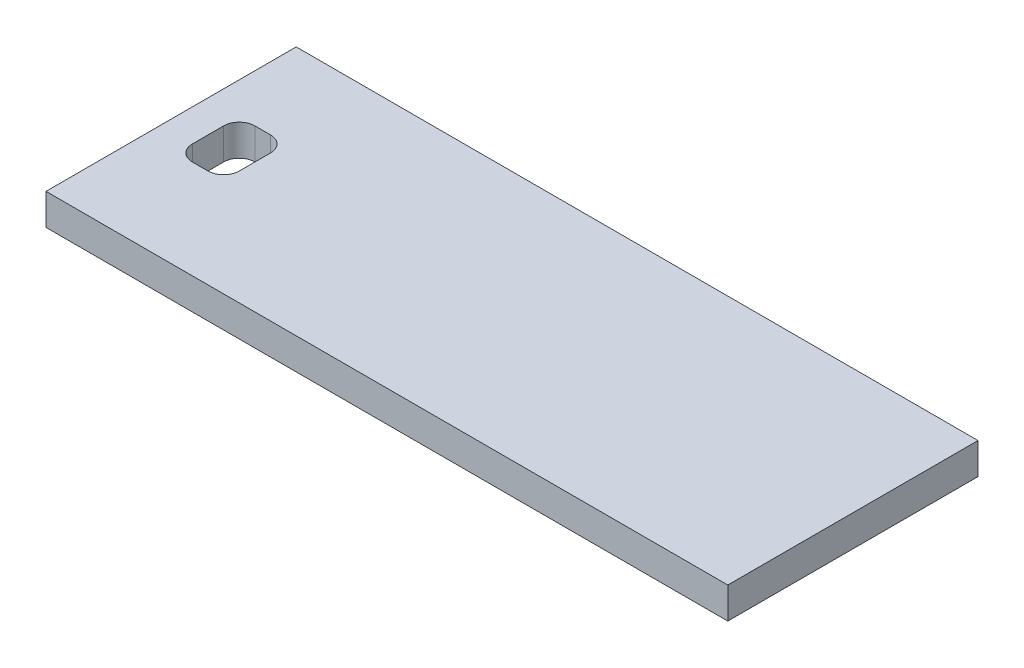
ISO-10303-21;
HEADER;
FILE_DESCRIPTION(('STEP AP214'),'2;1');
FILE_NAME('part.step','',(''),(''),'','','');
FILE_SCHEMA(('AUTOMOTIVE_DESIGN { 1 0 10303 214 1 1 1 1 }'));
ENDSEC;
DATA;
#1=APPLICATION_CONTEXT('core data for automotive mechanical design processes');
#2=APPLICATION_PROTOCOL_DEFINITION('international standard','automotive_design',2000,#1);
#3=PRODUCT_CONTEXT('',#1,'mechanical');
#4=PRODUCT('Part','Part','',(#3));
#5=PRODUCT_RELATED_PRODUCT_CATEGORY('part','',(#4));
#6=PRODUCT_DEFINITION_FORMATION('','',#4);
#7=PRODUCT_DEFINITION_CONTEXT('part definition',#1,'design');
#8=PRODUCT_DEFINITION('design','',#6,#7);
#9=PRODUCT_DEFINITION_SHAPE('','',#8);
#10=(LENGTH_UNIT() NAMED_UNIT(*) SI_UNIT(.MILLI.,.METRE.));
#11=(NAMED_UNIT(*) PLANE_ANGLE_UNIT() SI_UNIT($,.RADIAN.));
#12=(NAMED_UNIT(*) SI_UNIT($,.STERADIAN.) SOLID_ANGLE_UNIT());
#13=UNCERTAINTY_MEASURE_WITH_UNIT(LENGTH_MEASURE(1.E-05),#10,'distance_accuracy_value','');
#14=(GEOMETRIC_REPRESENTATION_CONTEXT(3) GLOBAL_UNCERTAINTY_ASSIGNED_CONTEXT((#13)) GLOBAL_UNIT_ASSIGNED_CONTEXT((#10,
#11,#12)) REPRESENTATION_CONTEXT('',''));
#15=CARTESIAN_POINT('',(0.,0.,0.));
#16=DIRECTION('',(0.,0.,1.));
#17=DIRECTION('',(1.,0.,0.));
#18=AXIS2_PLACEMENT_3D('',#15,#16,#17);
#19=CARTESIAN_POINT('',(109.,10.,-40.));
#20=DIRECTION('',(-1.,0.,0.));
#21=DIRECTION('',(0.,0.,1.));
#22=AXIS2_PLACEMENT_3D('',#19,#20,#21);
#23=PLANE('',#22);
#24=DIRECTION('',(0.,0.,-1.));
#25=VECTOR('',#24,1.);
#26=CARTESIAN_POINT('',(109.,0.,-40.));
#27=LINE('',#26,#25);
#28=CARTESIAN_POINT('',(109.,0.,40.));
#29=VERTEX_POINT('',#28);
#30=CARTESIAN_POINT('',(109.,0.,-40.));
#31=VERTEX_POINT('',#30);
#32=EDGE_CURVE('E148',#29,#31,#27,.T.);
#33=ORIENTED_EDGE('',*,*,#32,.T.);
#34=DIRECTION('',(0.,-1.,0.));
#35=VECTOR('',#34,1.);
#36=CARTESIAN_POINT('',(109.,10.,-40.));
#37=LINE('',#36,#35);
#38=CARTESIAN_POINT('',(109.,10.,-40.));
#39=VERTEX_POINT('',#38);
#40=EDGE_CURVE('E129',#39,#31,#37,.T.);
#41=ORIENTED_EDGE('',*,*,#40,.F.);
#42=DIRECTION('',(0.,0.,-1.));
#43=VECTOR('',#42,1.);
#44=CARTESIAN_POINT('',(109.,10.,-40.));
#45=LINE('',#44,#43);
#46=CARTESIAN_POINT('',(109.,10.,40.));
#47=VERTEX_POINT('',#46);
#48=EDGE_CURVE('E136',#47,#39,#45,.T.);
#49=ORIENTED_EDGE('',*,*,#48,.F.);
#50=DIRECTION('',(0.,-1.,0.));
#51=VECTOR('',#50,1.);
#52=CARTESIAN_POINT('',(109.,10.,40.));
#53=LINE('',#52,#51);
#54=EDGE_CURVE('E222',#47,#29,#53,.T.);
#55=ORIENTED_EDGE('',*,*,#54,.T.);
#56=EDGE_LOOP('',(#33,#41,#49,#55));
#57=FACE_BOUND('',#56,.T.);
#58=ADVANCED_FACE('F35',(#57),#23,.F.);
#59=CARTESIAN_POINT('',(-109.,10.,-40.));
#60=DIRECTION('',(0.,0.,1.));
#61=DIRECTION('',(1.,0.,0.));
#62=AXIS2_PLACEMENT_3D('',#59,#60,#61);
#63=PLANE('',#62);
#64=DIRECTION('',(-1.,0.,0.));
#65=VECTOR('',#64,1.);
#66=CARTESIAN_POINT('',(-109.,0.,-40.));
#67=LINE('',#66,#65);
#68=CARTESIAN_POINT('',(-109.,0.,-40.));
#69=VERTEX_POINT('',#68);
#70=EDGE_CURVE('E224',#31,#69,#67,.T.);
#71=ORIENTED_EDGE('',*,*,#70,.T.);
#72=DIRECTION('',(0.,-1.,0.));
#73=VECTOR('',#72,1.);
#74=CARTESIAN_POINT('',(-109.,10.,-40.));
#75=LINE('',#74,#73);
#76=CARTESIAN_POINT('',(-109.,10.,-40.));
#77=VERTEX_POINT('',#76);
#78=EDGE_CURVE('E132',#77,#69,#75,.T.);
#79=ORIENTED_EDGE('',*,*,#78,.F.);
#80=DIRECTION('',(-1.,0.,0.));
#81=VECTOR('',#80,1.);
#82=CARTESIAN_POINT('',(-109.,10.,-40.));
#83=LINE('',#82,#81);
#84=EDGE_CURVE('E125',#39,#77,#83,.T.);
#85=ORIENTED_EDGE('',*,*,#84,.F.);
#86=ORIENTED_EDGE('',*,*,#40,.T.);
#87=EDGE_LOOP('',(#71,#79,#85,#86));
#88=FACE_BOUND('',#87,.T.);
#89=ADVANCED_FACE('F127',(#88),#63,.F.);
#90=CARTESIAN_POINT('',(-109.,10.,-40.));
#91=DIRECTION('',(1.,0.,0.));
#92=DIRECTION('',(0.,0.,-1.));
#93=AXIS2_PLACEMENT_3D('',#90,#91,#92);
#94=PLANE('',#93);
#95=DIRECTION('',(0.,0.,1.));
#96=VECTOR('',#95,1.);
#97=CARTESIAN_POINT('',(-109.,0.,-40.));
#98=LINE('',#97,#96);
#99=CARTESIAN_POINT('',(-109.,0.,40.));
#100=VERTEX_POINT('',#99);
#101=EDGE_CURVE('E226',#69,#100,#98,.T.);
#102=ORIENTED_EDGE('',*,*,#101,.T.);
#103=DIRECTION('',(0.,-1.,0.));
#104=VECTOR('',#103,1.);
#105=CARTESIAN_POINT('',(-109.,10.,40.));
#106=LINE('',#105,#104);
#107=CARTESIAN_POINT('',(-109.,10.,40.));
#108=VERTEX_POINT('',#107);
#109=EDGE_CURVE('E153',#108,#100,#106,.T.);
#110=ORIENTED_EDGE('',*,*,#109,.F.);
#111=DIRECTION('',(0.,0.,1.));
#112=VECTOR('',#111,1.);
#113=CARTESIAN_POINT('',(-109.,10.,-40.));
#114=LINE('',#113,#112);
#115=EDGE_CURVE('E135',#77,#108,#114,.T.);
#116=ORIENTED_EDGE('',*,*,#115,.F.);
#117=ORIENTED_EDGE('',*,*,#78,.T.);
#118=EDGE_LOOP('',(#102,#110,#116,#117));
#119=FACE_BOUND('',#118,.T.);
#120=ADVANCED_FACE('F236',(#119),#94,.F.);
#121=CARTESIAN_POINT('',(-109.,10.,40.));
#122=DIRECTION('',(0.,0.,-1.));
#123=DIRECTION('',(-1.,0.,0.));
#124=AXIS2_PLACEMENT_3D('',#121,#122,#123);
#125=PLANE('',#124);
#126=DIRECTION('',(1.,0.,0.));
#127=VECTOR('',#126,1.);
#128=CARTESIAN_POINT('',(-109.,0.,40.));
#129=LINE('',#128,#127);
#130=EDGE_CURVE('E145',#100,#29,#129,.T.);
#131=ORIENTED_EDGE('',*,*,#130,.T.);
#132=ORIENTED_EDGE('',*,*,#54,.F.);
#133=DIRECTION('',(1.,0.,0.));
#134=VECTOR('',#133,1.);
#135=CARTESIAN_POINT('',(-109.,10.,40.));
#136=LINE('',#135,#134);
#137=EDGE_CURVE('E141',#108,#47,#136,.T.);
#138=ORIENTED_EDGE('',*,*,#137,.F.);
#139=ORIENTED_EDGE('',*,*,#109,.T.);
#140=EDGE_LOOP('',(#131,#132,#138,#139));
#141=FACE_BOUND('',#140,.T.);
#142=ADVANCED_FACE('F233',(#141),#125,.F.);
#143=CARTESIAN_POINT('',(0.,10.,0.));
#144=DIRECTION('',(0.,1.,0.));
#145=DIRECTION('',(0.,0.,1.));
#146=AXIS2_PLACEMENT_3D('',#143,#144,#145);
#147=PLANE('',#146);
#148=DIRECTION('',(0.,0.,1.));
#149=VECTOR('',#148,1.);
#150=CARTESIAN_POINT('',(-98.7348332922292,10.,8.4711741568453));
#151=LINE('',#150,#149);
#152=CARTESIAN_POINT('',(-98.7348332922292,10.,-6.5288258431547));
#153=VERTEX_POINT('',#152);
#154=CARTESIAN_POINT('',(-98.7348332922292,10.,3.4711741568453));
#155=VERTEX_POINT('',#154);
#156=EDGE_CURVE('E188',#153,#155,#151,.T.);
#157=ORIENTED_EDGE('',*,*,#156,.F.);
#158=CARTESIAN_POINT('',(-93.7348332922292,10.,-6.5288258431547));
#159=DIRECTION('',(0.,1.,0.));
#160=DIRECTION('',(0.,0.,1.));
#161=AXIS2_PLACEMENT_3D('',#158,#159,#160);
#162=CIRCLE('',#161,5.);
#163=CARTESIAN_POINT('',(-93.7348332922292,10.,-11.5288258431547));
#164=VERTEX_POINT('',#163);
#165=EDGE_CURVE('E43',#153,#164,#162,.F.);
#166=ORIENTED_EDGE('',*,*,#165,.T.);
#167=DIRECTION('',(-1.,0.,0.));
#168=VECTOR('',#167,1.);
#169=CARTESIAN_POINT('',(-83.7348332922292,10.,-11.5288258431547));
#170=LINE('',#169,#168);
#171=CARTESIAN_POINT('',(-88.7348332922292,10.,-11.5288258431547));
#172=VERTEX_POINT('',#171);
#173=EDGE_CURVE('E186',#172,#164,#170,.T.);
#174=ORIENTED_EDGE('',*,*,#173,.F.);
#175=CARTESIAN_POINT('',(-88.7348332922292,10.,-6.5288258431547));
#176=DIRECTION('',(0.,1.,0.));
#177=DIRECTION('',(0.,0.,1.));
#178=AXIS2_PLACEMENT_3D('',#175,#176,#177);
#179=CIRCLE('',#178,5.);
#180=CARTESIAN_POINT('',(-83.7348332922292,10.,-6.5288258431547));
#181=VERTEX_POINT('',#180);
#182=EDGE_CURVE('E181',#172,#181,#179,.F.);
#183=ORIENTED_EDGE('',*,*,#182,.T.);
#184=DIRECTION('',(0.,0.,-1.));
#185=VECTOR('',#184,1.);
#186=CARTESIAN_POINT('',(-83.7348332922292,10.,8.4711741568453));
#187=LINE('',#186,#185);
#188=CARTESIAN_POINT('',(-83.7348332922292,10.,3.4711741568453));
#189=VERTEX_POINT('',#188);
#190=EDGE_CURVE('E194',#189,#181,#187,.T.);
#191=ORIENTED_EDGE('',*,*,#190,.F.);
#192=CARTESIAN_POINT('',(-88.7348332922292,10.,3.4711741568453));
#193=DIRECTION('',(0.,1.,0.));
#194=DIRECTION('',(0.,0.,1.));
#195=AXIS2_PLACEMENT_3D('',#192,#193,#194);
#196=CIRCLE('',#195,5.);
#197=CARTESIAN_POINT('',(-88.7348332922292,10.,8.4711741568453));
#198=VERTEX_POINT('',#197);
#199=EDGE_CURVE('E177',#189,#198,#196,.F.);
#200=ORIENTED_EDGE('',*,*,#199,.T.);
#201=DIRECTION('',(1.,0.,0.));
#202=VECTOR('',#201,1.);
#203=CARTESIAN_POINT('',(-83.7348332922292,10.,8.4711741568453));
#204=LINE('',#203,#202);
#205=CARTESIAN_POINT('',(-93.7348332922292,10.,8.4711741568453));
#206=VERTEX_POINT('',#205);
#207=EDGE_CURVE('E215',#206,#198,#204,.T.);
#208=ORIENTED_EDGE('',*,*,#207,.F.);
#209=CARTESIAN_POINT('',(-93.7348332922292,10.,3.4711741568453));
#210=DIRECTION('',(0.,1.,0.));
#211=DIRECTION('',(0.,0.,1.));
#212=AXIS2_PLACEMENT_3D('',#209,#210,#211);
#213=CIRCLE('',#212,5.);
#214=EDGE_CURVE('E173',#206,#155,#213,.F.);
#215=ORIENTED_EDGE('',*,*,#214,.T.);
#216=EDGE_LOOP('',(#157,#166,#174,#183,#191,#200,#208,#215));
#217=FACE_BOUND('',#216,.T.);
#218=ORIENTED_EDGE('',*,*,#48,.T.);
#219=ORIENTED_EDGE('',*,*,#84,.T.);
#220=ORIENTED_EDGE('',*,*,#115,.T.);
#221=ORIENTED_EDGE('',*,*,#137,.T.);
#222=EDGE_LOOP('',(#218,#219,#220,#221));
#223=FACE_BOUND('',#222,.T.);
#224=ADVANCED_FACE('F139',(#217,#223),#147,.T.);
#225=CARTESIAN_POINT('',(0.,0.,0.));
#226=DIRECTION('',(0.,1.,0.));
#227=DIRECTION('',(0.,0.,1.));
#228=AXIS2_PLACEMENT_3D('',#225,#226,#227);
#229=PLANE('',#228);
#230=DIRECTION('',(0.,0.,-1.));
#231=VECTOR('',#230,1.);
#232=CARTESIAN_POINT('',(-83.7348332922292,0.,8.4711741568453));
#233=LINE('',#232,#231);
#234=CARTESIAN_POINT('',(-83.7348332922292,0.,3.4711741568453));
#235=VERTEX_POINT('',#234);
#236=CARTESIAN_POINT('',(-83.7348332922292,0.,-6.5288258431547));
#237=VERTEX_POINT('',#236);
#238=EDGE_CURVE('E209',#235,#237,#233,.T.);
#239=ORIENTED_EDGE('',*,*,#238,.T.);
#240=CARTESIAN_POINT('',(-88.7348332922292,0.,-6.5288258431547));
#241=DIRECTION('',(0.,1.,0.));
#242=DIRECTION('',(0.,0.,1.));
#243=AXIS2_PLACEMENT_3D('',#240,#241,#242);
#244=CIRCLE('',#243,5.);
#245=CARTESIAN_POINT('',(-88.7348332922292,0.,-11.5288258431547));
#246=VERTEX_POINT('',#245);
#247=EDGE_CURVE('E57',#237,#246,#244,.T.);
#248=ORIENTED_EDGE('',*,*,#247,.T.);
#249=DIRECTION('',(-1.,0.,0.));
#250=VECTOR('',#249,1.);
#251=CARTESIAN_POINT('',(-83.7348332922292,0.,-11.5288258431547));
#252=LINE('',#251,#250);
#253=CARTESIAN_POINT('',(-93.7348332922292,0.,-11.5288258431547));
#254=VERTEX_POINT('',#253);
#255=EDGE_CURVE('E202',#246,#254,#252,.T.);
#256=ORIENTED_EDGE('',*,*,#255,.T.);
#257=CARTESIAN_POINT('',(-93.7348332922292,0.,-6.5288258431547));
#258=DIRECTION('',(0.,1.,0.));
#259=DIRECTION('',(0.,0.,1.));
#260=AXIS2_PLACEMENT_3D('',#257,#258,#259);
#261=CIRCLE('',#260,5.);
#262=CARTESIAN_POINT('',(-98.7348332922292,0.,-6.5288258431547));
#263=VERTEX_POINT('',#262);
#264=EDGE_CURVE('E11',#254,#263,#261,.T.);
#265=ORIENTED_EDGE('',*,*,#264,.T.);
#266=DIRECTION('',(0.,0.,1.));
#267=VECTOR('',#266,1.);
#268=CARTESIAN_POINT('',(-98.7348332922292,0.,8.4711741568453));
#269=LINE('',#268,#267);
#270=CARTESIAN_POINT('',(-98.7348332922292,0.,3.4711741568453));
#271=VERTEX_POINT('',#270);
#272=EDGE_CURVE('E193',#263,#271,#269,.T.);
#273=ORIENTED_EDGE('',*,*,#272,.T.);
#274=CARTESIAN_POINT('',(-93.7348332922292,0.,3.4711741568453));
#275=DIRECTION('',(0.,1.,0.));
#276=DIRECTION('',(0.,0.,1.));
#277=AXIS2_PLACEMENT_3D('',#274,#275,#276);
#278=CIRCLE('',#277,5.);
#279=CARTESIAN_POINT('',(-93.7348332922292,0.,8.4711741568453));
#280=VERTEX_POINT('',#279);
#281=EDGE_CURVE('E175',#271,#280,#278,.T.);
#282=ORIENTED_EDGE('',*,*,#281,.T.);
#283=DIRECTION('',(1.,0.,0.));
#284=VECTOR('',#283,1.);
#285=CARTESIAN_POINT('',(-83.7348332922292,0.,8.4711741568453));
#286=LINE('',#285,#284);
#287=CARTESIAN_POINT('',(-88.7348332922292,0.,8.4711741568453));
#288=VERTEX_POINT('',#287);
#289=EDGE_CURVE('E206',#280,#288,#286,.T.);
#290=ORIENTED_EDGE('',*,*,#289,.T.);
#291=CARTESIAN_POINT('',(-88.7348332922292,0.,3.4711741568453));
#292=DIRECTION('',(0.,1.,0.));
#293=DIRECTION('',(0.,0.,1.));
#294=AXIS2_PLACEMENT_3D('',#291,#292,#293);
#295=CIRCLE('',#294,5.);
#296=EDGE_CURVE('E179',#288,#235,#295,.T.);
#297=ORIENTED_EDGE('',*,*,#296,.T.);
#298=EDGE_LOOP('',(#239,#248,#256,#265,#273,#282,#290,#297));
#299=FACE_BOUND('',#298,.T.);
#300=ORIENTED_EDGE('',*,*,#32,.F.);
#301=ORIENTED_EDGE('',*,*,#130,.F.);
#302=ORIENTED_EDGE('',*,*,#101,.F.);
#303=ORIENTED_EDGE('',*,*,#70,.F.);
#304=EDGE_LOOP('',(#300,#301,#302,#303));
#305=FACE_BOUND('',#304,.T.);
#306=ADVANCED_FACE('F199',(#299,#305),#229,.F.);
#307=CARTESIAN_POINT('',(-98.7348332922292,0.,8.4711741568453));
#308=DIRECTION('',(-1.,0.,0.));
#309=DIRECTION('',(0.,0.,1.));
#310=AXIS2_PLACEMENT_3D('',#307,#308,#309);
#311=PLANE('',#310);
#312=ORIENTED_EDGE('',*,*,#156,.T.);
#313=DIRECTION('',(0.,1.,0.));
#314=VECTOR('',#313,1.);
#315=CARTESIAN_POINT('',(-98.7348332922292,0.,3.4711741568453));
#316=LINE('',#315,#314);
#317=EDGE_CURVE('E162',#155,#271,#316,.F.);
#318=ORIENTED_EDGE('',*,*,#317,.T.);
#319=ORIENTED_EDGE('',*,*,#272,.F.);
#320=DIRECTION('',(0.,1.,0.));
#321=VECTOR('',#320,1.);
#322=CARTESIAN_POINT('',(-98.7348332922292,10.,-6.5288258431547));
#323=LINE('',#322,#321);
#324=EDGE_CURVE('E159',#263,#153,#323,.T.);
#325=ORIENTED_EDGE('',*,*,#324,.T.);
#326=EDGE_LOOP('',(#312,#318,#319,#325));
#327=FACE_BOUND('',#326,.T.);
#328=ADVANCED_FACE('F204',(#327),#311,.F.);
#329=CARTESIAN_POINT('',(-83.7348332922292,0.,-11.5288258431547));
#330=DIRECTION('',(0.,0.,-1.));
#331=DIRECTION('',(-1.,0.,0.));
#332=AXIS2_PLACEMENT_3D('',#329,#330,#331);
#333=PLANE('',#332);
#334=ORIENTED_EDGE('',*,*,#255,.F.);
#335=DIRECTION('',(0.,1.,0.));
#336=VECTOR('',#335,1.);
#337=CARTESIAN_POINT('',(-88.7348332922292,10.,-11.5288258431547));
#338=LINE('',#337,#336);
#339=EDGE_CURVE('E170',#246,#172,#338,.T.);
#340=ORIENTED_EDGE('',*,*,#339,.T.);
#341=ORIENTED_EDGE('',*,*,#173,.T.);
#342=DIRECTION('',(0.,1.,0.));
#343=VECTOR('',#342,1.);
#344=CARTESIAN_POINT('',(-93.7348332922292,0.,-11.5288258431547));
#345=LINE('',#344,#343);
#346=EDGE_CURVE('E50',#164,#254,#345,.F.);
#347=ORIENTED_EDGE('',*,*,#346,.T.);
#348=EDGE_LOOP('',(#334,#340,#341,#347));
#349=FACE_BOUND('',#348,.T.);
#350=ADVANCED_FACE('F191',(#349),#333,.F.);
#351=CARTESIAN_POINT('',(-83.7348332922292,0.,8.4711741568453));
#352=DIRECTION('',(1.,0.,0.));
#353=DIRECTION('',(0.,0.,-1.));
#354=AXIS2_PLACEMENT_3D('',#351,#352,#353);
#355=PLANE('',#354);
#356=ORIENTED_EDGE('',*,*,#238,.F.);
#357=DIRECTION('',(0.,1.,0.));
#358=VECTOR('',#357,1.);
#359=CARTESIAN_POINT('',(-83.7348332922292,10.,3.4711741568453));
#360=LINE('',#359,#358);
#361=EDGE_CURVE('E166',#235,#189,#360,.T.);
#362=ORIENTED_EDGE('',*,*,#361,.T.);
#363=ORIENTED_EDGE('',*,*,#190,.T.);
#364=DIRECTION('',(0.,1.,0.));
#365=VECTOR('',#364,1.);
#366=CARTESIAN_POINT('',(-83.7348332922292,0.,-6.5288258431547));
#367=LINE('',#366,#365);
#368=EDGE_CURVE('E164',#181,#237,#367,.F.);
#369=ORIENTED_EDGE('',*,*,#368,.T.);
#370=EDGE_LOOP('',(#356,#362,#363,#369));
#371=FACE_BOUND('',#370,.T.);
#372=ADVANCED_FACE('F268',(#371),#355,.F.);
#373=CARTESIAN_POINT('',(-83.7348332922292,0.,8.4711741568453));
#374=DIRECTION('',(0.,0.,1.));
#375=DIRECTION('',(1.,0.,0.));
#376=AXIS2_PLACEMENT_3D('',#373,#374,#375);
#377=PLANE('',#376);
#378=ORIENTED_EDGE('',*,*,#289,.F.);
#379=DIRECTION('',(0.,1.,0.));
#380=VECTOR('',#379,1.);
#381=CARTESIAN_POINT('',(-93.7348332922292,10.,8.4711741568453));
#382=LINE('',#381,#380);
#383=EDGE_CURVE('E151',#280,#206,#382,.T.);
#384=ORIENTED_EDGE('',*,*,#383,.T.);
#385=ORIENTED_EDGE('',*,*,#207,.T.);
#386=DIRECTION('',(0.,1.,0.));
#387=VECTOR('',#386,1.);
#388=CARTESIAN_POINT('',(-88.7348332922292,0.,8.4711741568453));
#389=LINE('',#388,#387);
#390=EDGE_CURVE('E149',#198,#288,#389,.F.);
#391=ORIENTED_EDGE('',*,*,#390,.T.);
#392=EDGE_LOOP('',(#378,#384,#385,#391));
#393=FACE_BOUND('',#392,.T.);
#394=ADVANCED_FACE('F254',(#393),#377,.F.);
#395=CARTESIAN_POINT('',(-93.7348332922292,0.,3.4711741568453));
#396=DIRECTION('',(0.,-1.,0.));
#397=DIRECTION('',(0.,0.,-1.));
#398=AXIS2_PLACEMENT_3D('',#395,#396,#397);
#399=CYLINDRICAL_SURFACE('',#398,5.);
#400=ORIENTED_EDGE('',*,*,#281,.F.);
#401=ORIENTED_EDGE('',*,*,#317,.F.);
#402=ORIENTED_EDGE('',*,*,#214,.F.);
#403=ORIENTED_EDGE('',*,*,#383,.F.);
#404=EDGE_LOOP('',(#400,#401,#402,#403));
#405=FACE_BOUND('',#404,.T.);
#406=ADVANCED_FACE('F250',(#405),#399,.F.);
#407=CARTESIAN_POINT('',(-88.7348332922292,0.,3.4711741568453));
#408=DIRECTION('',(0.,-1.,0.));
#409=DIRECTION('',(0.,0.,-1.));
#410=AXIS2_PLACEMENT_3D('',#407,#408,#409);
#411=CYLINDRICAL_SURFACE('',#410,5.);
#412=ORIENTED_EDGE('',*,*,#296,.F.);
#413=ORIENTED_EDGE('',*,*,#390,.F.);
#414=ORIENTED_EDGE('',*,*,#199,.F.);
#415=ORIENTED_EDGE('',*,*,#361,.F.);
#416=EDGE_LOOP('',(#412,#413,#414,#415));
#417=FACE_BOUND('',#416,.T.);
#418=ADVANCED_FACE('F253',(#417),#411,.F.);
#419=CARTESIAN_POINT('',(-88.7348332922292,0.,-6.5288258431547));
#420=DIRECTION('',(0.,-1.,0.));
#421=DIRECTION('',(0.,0.,-1.));
#422=AXIS2_PLACEMENT_3D('',#419,#420,#421);
#423=CYLINDRICAL_SURFACE('',#422,5.);
#424=ORIENTED_EDGE('',*,*,#247,.F.);
#425=ORIENTED_EDGE('',*,*,#368,.F.);
#426=ORIENTED_EDGE('',*,*,#182,.F.);
#427=ORIENTED_EDGE('',*,*,#339,.F.);
#428=EDGE_LOOP('',(#424,#425,#426,#427));
#429=FACE_BOUND('',#428,.T.);
#430=ADVANCED_FACE('F257',(#429),#423,.F.);
#431=CARTESIAN_POINT('',(-93.7348332922292,0.,-6.5288258431547));
#432=DIRECTION('',(0.,-1.,0.));
#433=DIRECTION('',(0.,0.,-1.));
#434=AXIS2_PLACEMENT_3D('',#431,#432,#433);
#435=CYLINDRICAL_SURFACE('',#434,5.);
#436=ORIENTED_EDGE('',*,*,#264,.F.);
#437=ORIENTED_EDGE('',*,*,#346,.F.);
#438=ORIENTED_EDGE('',*,*,#165,.F.);
#439=ORIENTED_EDGE('',*,*,#324,.F.);
#440=EDGE_LOOP('',(#436,#437,#438,#439));
#441=FACE_BOUND('',#440,.T.);
#442=ADVANCED_FACE('F37',(#441),#435,.F.);
#443=CLOSED_SHELL('',(#58,#89,#120,#142,#224,#306,#328,#350,#372,#394,#406,#418,#430,#442));
#444=MANIFOLD_SOLID_BREP('B2',#443);
#445=ADVANCED_BREP_SHAPE_REPRESENTATION('',(#18,#444),#14);
#446=SHAPE_DEFINITION_REPRESENTATION(#9,#445);
ENDSEC;
END-ISO-10303-21;
